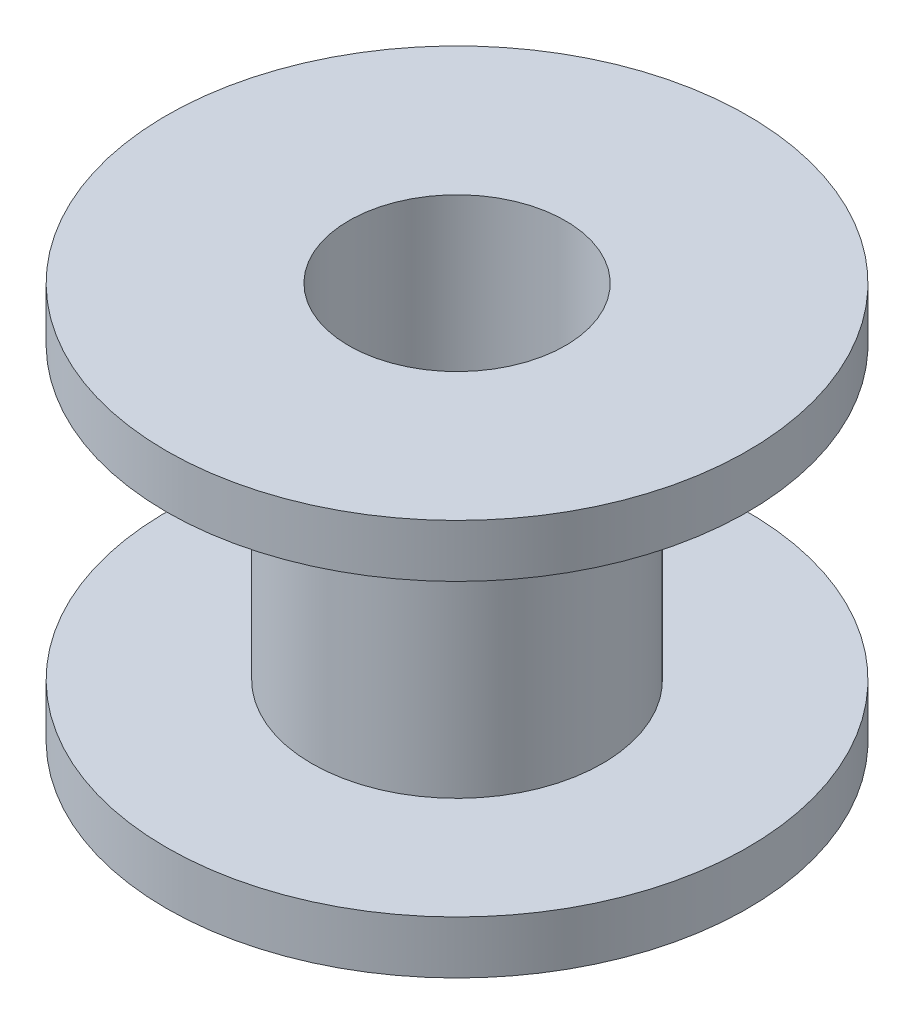
ISO-10303-21;
HEADER;
FILE_DESCRIPTION(('STEP AP214'),'2;1');
FILE_NAME('part.step','',(''),(''),'','','');
FILE_SCHEMA(('AUTOMOTIVE_DESIGN { 1 0 10303 214 1 1 1 1 }'));
ENDSEC;
DATA;
#1=APPLICATION_CONTEXT('core data for automotive mechanical design processes');
#2=APPLICATION_PROTOCOL_DEFINITION('international standard','automotive_design',2000,#1);
#3=PRODUCT_CONTEXT('',#1,'mechanical');
#4=PRODUCT('Part','Part','',(#3));
#5=PRODUCT_RELATED_PRODUCT_CATEGORY('part','',(#4));
#6=PRODUCT_DEFINITION_FORMATION('','',#4);
#7=PRODUCT_DEFINITION_CONTEXT('part definition',#1,'design');
#8=PRODUCT_DEFINITION('design','',#6,#7);
#9=PRODUCT_DEFINITION_SHAPE('','',#8);
#10=(LENGTH_UNIT() NAMED_UNIT(*) SI_UNIT(.MILLI.,.METRE.));
#11=(NAMED_UNIT(*) PLANE_ANGLE_UNIT() SI_UNIT($,.RADIAN.));
#12=(NAMED_UNIT(*) SI_UNIT($,.STERADIAN.) SOLID_ANGLE_UNIT());
#13=UNCERTAINTY_MEASURE_WITH_UNIT(LENGTH_MEASURE(1.E-05),#10,'distance_accuracy_value','');
#14=(GEOMETRIC_REPRESENTATION_CONTEXT(3) GLOBAL_UNCERTAINTY_ASSIGNED_CONTEXT((#13)) GLOBAL_UNIT_ASSIGNED_CONTEXT((#10,
#11,#12)) REPRESENTATION_CONTEXT('',''));
#15=CARTESIAN_POINT('',(0.,0.,0.));
#16=DIRECTION('',(0.,0.,1.));
#17=DIRECTION('',(1.,0.,0.));
#18=AXIS2_PLACEMENT_3D('',#15,#16,#17);
#19=CARTESIAN_POINT('',(0.,-5.5,5.49999999999999));
#20=DIRECTION('',(0.,1.,0.));
#21=DIRECTION('',(0.,0.,1.));
#22=AXIS2_PLACEMENT_3D('',#19,#20,#21);
#23=PLANE('',#22);
#24=CARTESIAN_POINT('',(0.,-5.5,0.));
#25=DIRECTION('',(0.,1.,0.));
#26=DIRECTION('',(0.,0.,1.));
#27=AXIS2_PLACEMENT_3D('',#24,#25,#26);
#28=CIRCLE('',#27,11.);
#29=CARTESIAN_POINT('',(0.,-5.5,11.));
#30=VERTEX_POINT('',#29);
#31=EDGE_CURVE('E10',#30,#30,#28,.T.);
#32=ORIENTED_EDGE('',*,*,#31,.T.);
#33=EDGE_LOOP('',(#32));
#34=FACE_BOUND('',#33,.T.);
#35=CARTESIAN_POINT('',(0.,-5.5,0.));
#36=DIRECTION('',(0.,1.,0.));
#37=DIRECTION('',(0.,0.,1.));
#38=AXIS2_PLACEMENT_3D('',#35,#36,#37);
#39=CIRCLE('',#38,5.49999999999999);
#40=CARTESIAN_POINT('',(0.,-5.5,5.49999999999999));
#41=VERTEX_POINT('',#40);
#42=EDGE_CURVE('E59',#41,#41,#39,.T.);
#43=ORIENTED_EDGE('',*,*,#42,.F.);
#44=EDGE_LOOP('',(#43));
#45=FACE_BOUND('',#44,.T.);
#46=ADVANCED_FACE('F31',(#34,#45),#23,.T.);
#47=CARTESIAN_POINT('',(0.,44.6590909090909,0.));
#48=DIRECTION('',(0.,1.,0.));
#49=DIRECTION('',(0.,0.,1.));
#50=AXIS2_PLACEMENT_3D('',#47,#48,#49);
#51=CYLINDRICAL_SURFACE('',#50,11.);
#52=CARTESIAN_POINT('',(0.,-7.5,0.));
#53=DIRECTION('',(0.,1.,0.));
#54=DIRECTION('',(0.,0.,1.));
#55=AXIS2_PLACEMENT_3D('',#52,#53,#54);
#56=CIRCLE('',#55,11.);
#57=CARTESIAN_POINT('',(0.,-7.5,11.));
#58=VERTEX_POINT('',#57);
#59=EDGE_CURVE('E37',#58,#58,#56,.T.);
#60=ORIENTED_EDGE('',*,*,#59,.T.);
#61=EDGE_LOOP('',(#60));
#62=FACE_BOUND('',#61,.T.);
#63=ORIENTED_EDGE('',*,*,#31,.F.);
#64=EDGE_LOOP('',(#63));
#65=FACE_BOUND('',#64,.T.);
#66=ADVANCED_FACE('F67',(#62,#65),#51,.T.);
#67=CARTESIAN_POINT('',(0.,-7.5,11.));
#68=DIRECTION('',(0.,-1.,0.));
#69=DIRECTION('',(0.,0.,-1.));
#70=AXIS2_PLACEMENT_3D('',#67,#68,#69);
#71=PLANE('',#70);
#72=CARTESIAN_POINT('',(0.,-7.5,0.));
#73=DIRECTION('',(0.,1.,0.));
#74=DIRECTION('',(0.,0.,1.));
#75=AXIS2_PLACEMENT_3D('',#72,#73,#74);
#76=CIRCLE('',#75,4.09999999999999);
#77=CARTESIAN_POINT('',(0.,-7.5,4.09999999999999));
#78=VERTEX_POINT('',#77);
#79=EDGE_CURVE('E41',#78,#78,#76,.T.);
#80=ORIENTED_EDGE('',*,*,#79,.T.);
#81=EDGE_LOOP('',(#80));
#82=FACE_BOUND('',#81,.T.);
#83=ORIENTED_EDGE('',*,*,#59,.F.);
#84=EDGE_LOOP('',(#83));
#85=FACE_BOUND('',#84,.T.);
#86=ADVANCED_FACE('F71',(#82,#85),#71,.T.);
#87=CARTESIAN_POINT('',(0.,44.6590909090909,0.));
#88=DIRECTION('',(0.,1.,0.));
#89=DIRECTION('',(0.,0.,1.));
#90=AXIS2_PLACEMENT_3D('',#87,#88,#89);
#91=CYLINDRICAL_SURFACE('',#90,4.09999999999999);
#92=CARTESIAN_POINT('',(0.,7.5,0.));
#93=DIRECTION('',(0.,1.,0.));
#94=DIRECTION('',(0.,0.,1.));
#95=AXIS2_PLACEMENT_3D('',#92,#93,#94);
#96=CIRCLE('',#95,4.09999999999999);
#97=CARTESIAN_POINT('',(0.,7.5,4.09999999999999));
#98=VERTEX_POINT('',#97);
#99=EDGE_CURVE('E45',#98,#98,#96,.T.);
#100=ORIENTED_EDGE('',*,*,#99,.T.);
#101=EDGE_LOOP('',(#100));
#102=FACE_BOUND('',#101,.T.);
#103=ORIENTED_EDGE('',*,*,#79,.F.);
#104=EDGE_LOOP('',(#103));
#105=FACE_BOUND('',#104,.T.);
#106=ADVANCED_FACE('F75',(#102,#105),#91,.F.);
#107=CARTESIAN_POINT('',(0.,7.5,11.));
#108=DIRECTION('',(0.,1.,0.));
#109=DIRECTION('',(0.,0.,1.));
#110=AXIS2_PLACEMENT_3D('',#107,#108,#109);
#111=PLANE('',#110);
#112=CARTESIAN_POINT('',(0.,7.5,0.));
#113=DIRECTION('',(0.,1.,0.));
#114=DIRECTION('',(0.,0.,1.));
#115=AXIS2_PLACEMENT_3D('',#112,#113,#114);
#116=CIRCLE('',#115,11.);
#117=CARTESIAN_POINT('',(0.,7.5,11.));
#118=VERTEX_POINT('',#117);
#119=EDGE_CURVE('E50',#118,#118,#116,.T.);
#120=ORIENTED_EDGE('',*,*,#119,.T.);
#121=EDGE_LOOP('',(#120));
#122=FACE_BOUND('',#121,.T.);
#123=ORIENTED_EDGE('',*,*,#99,.F.);
#124=EDGE_LOOP('',(#123));
#125=FACE_BOUND('',#124,.T.);
#126=ADVANCED_FACE('F82',(#122,#125),#111,.T.);
#127=CARTESIAN_POINT('',(0.,44.6590909090909,0.));
#128=DIRECTION('',(0.,1.,0.));
#129=DIRECTION('',(0.,0.,1.));
#130=AXIS2_PLACEMENT_3D('',#127,#128,#129);
#131=CYLINDRICAL_SURFACE('',#130,11.);
#132=CARTESIAN_POINT('',(0.,5.5,0.));
#133=DIRECTION('',(0.,1.,0.));
#134=DIRECTION('',(0.,0.,1.));
#135=AXIS2_PLACEMENT_3D('',#132,#133,#134);
#136=CIRCLE('',#135,11.);
#137=CARTESIAN_POINT('',(0.,5.5,11.));
#138=VERTEX_POINT('',#137);
#139=EDGE_CURVE('E53',#138,#138,#136,.T.);
#140=ORIENTED_EDGE('',*,*,#139,.T.);
#141=EDGE_LOOP('',(#140));
#142=FACE_BOUND('',#141,.T.);
#143=ORIENTED_EDGE('',*,*,#119,.F.);
#144=EDGE_LOOP('',(#143));
#145=FACE_BOUND('',#144,.T.);
#146=ADVANCED_FACE('F86',(#142,#145),#131,.T.);
#147=CARTESIAN_POINT('',(0.,5.5,5.49999999999999));
#148=DIRECTION('',(0.,-1.,0.));
#149=DIRECTION('',(0.,0.,-1.));
#150=AXIS2_PLACEMENT_3D('',#147,#148,#149);
#151=PLANE('',#150);
#152=CARTESIAN_POINT('',(0.,5.5,0.));
#153=DIRECTION('',(0.,1.,0.));
#154=DIRECTION('',(0.,0.,1.));
#155=AXIS2_PLACEMENT_3D('',#152,#153,#154);
#156=CIRCLE('',#155,5.49999999999999);
#157=CARTESIAN_POINT('',(0.,5.5,5.49999999999999));
#158=VERTEX_POINT('',#157);
#159=EDGE_CURVE('E56',#158,#158,#156,.T.);
#160=ORIENTED_EDGE('',*,*,#159,.T.);
#161=EDGE_LOOP('',(#160));
#162=FACE_BOUND('',#161,.T.);
#163=ORIENTED_EDGE('',*,*,#139,.F.);
#164=EDGE_LOOP('',(#163));
#165=FACE_BOUND('',#164,.T.);
#166=ADVANCED_FACE('F90',(#162,#165),#151,.T.);
#167=CARTESIAN_POINT('',(0.,44.6590909090909,0.));
#168=DIRECTION('',(0.,1.,0.));
#169=DIRECTION('',(0.,0.,1.));
#170=AXIS2_PLACEMENT_3D('',#167,#168,#169);
#171=CYLINDRICAL_SURFACE('',#170,5.49999999999999);
#172=ORIENTED_EDGE('',*,*,#42,.T.);
#173=EDGE_LOOP('',(#172));
#174=FACE_BOUND('',#173,.T.);
#175=ORIENTED_EDGE('',*,*,#159,.F.);
#176=EDGE_LOOP('',(#175));
#177=FACE_BOUND('',#176,.T.);
#178=ADVANCED_FACE('F63',(#174,#177),#171,.T.);
#179=CLOSED_SHELL('',(#46,#66,#86,#106,#126,#146,#166,#178));
#180=MANIFOLD_SOLID_BREP('B2',#179);
#181=ADVANCED_BREP_SHAPE_REPRESENTATION('',(#18,#180),#14);
#182=SHAPE_DEFINITION_REPRESENTATION(#9,#181);
ENDSEC;
END-ISO-10303-21;
